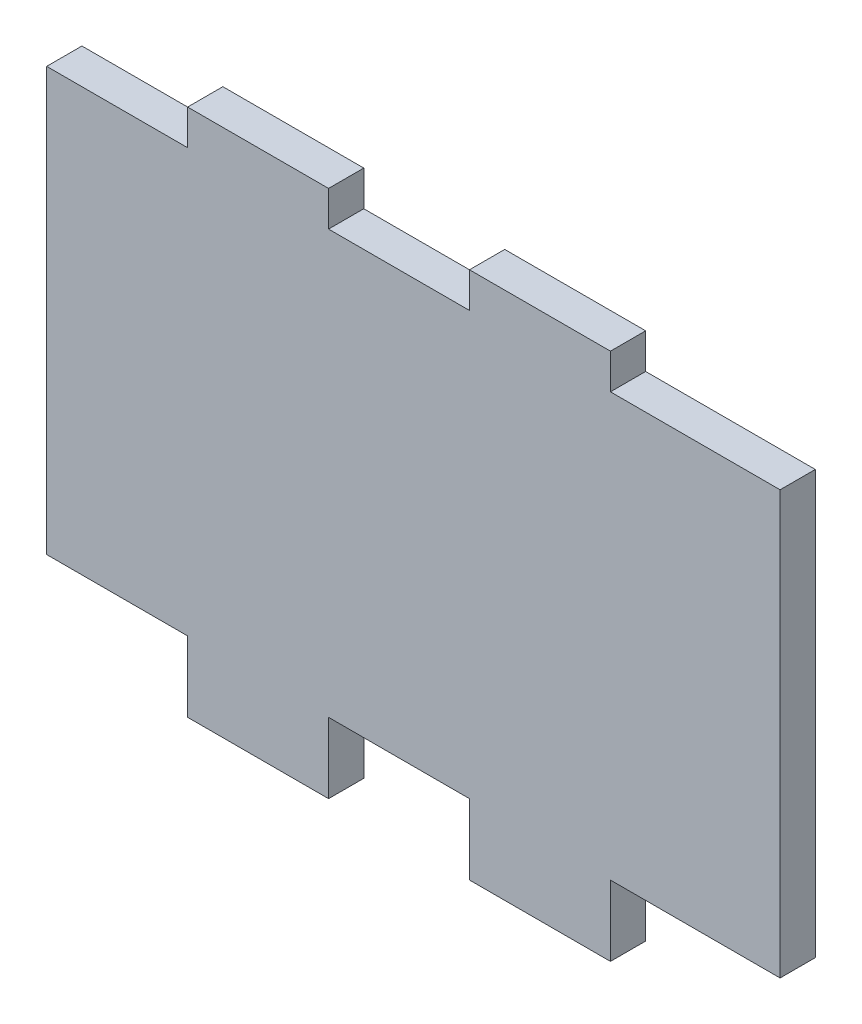
ISO-10303-21;
HEADER;
FILE_DESCRIPTION(('STEP AP214'),'2;1');
FILE_NAME('part.step','',(''),(''),'','','');
FILE_SCHEMA(('AUTOMOTIVE_DESIGN { 1 0 10303 214 1 1 1 1 }'));
ENDSEC;
DATA;
#1=APPLICATION_CONTEXT('core data for automotive mechanical design processes');
#2=APPLICATION_PROTOCOL_DEFINITION('international standard','automotive_design',2000,#1);
#3=PRODUCT_CONTEXT('',#1,'mechanical');
#4=PRODUCT('Part','Part','',(#3));
#5=PRODUCT_RELATED_PRODUCT_CATEGORY('part','',(#4));
#6=PRODUCT_DEFINITION_FORMATION('','',#4);
#7=PRODUCT_DEFINITION_CONTEXT('part definition',#1,'design');
#8=PRODUCT_DEFINITION('design','',#6,#7);
#9=PRODUCT_DEFINITION_SHAPE('','',#8);
#10=(LENGTH_UNIT() NAMED_UNIT(*) SI_UNIT(.MILLI.,.METRE.));
#11=(NAMED_UNIT(*) PLANE_ANGLE_UNIT() SI_UNIT($,.RADIAN.));
#12=(NAMED_UNIT(*) SI_UNIT($,.STERADIAN.) SOLID_ANGLE_UNIT());
#13=UNCERTAINTY_MEASURE_WITH_UNIT(LENGTH_MEASURE(1.E-05),#10,'distance_accuracy_value','');
#14=(GEOMETRIC_REPRESENTATION_CONTEXT(3) GLOBAL_UNCERTAINTY_ASSIGNED_CONTEXT((#13)) GLOBAL_UNIT_ASSIGNED_CONTEXT((#10,
#11,#12)) REPRESENTATION_CONTEXT('',''));
#15=CARTESIAN_POINT('',(0.,0.,0.));
#16=DIRECTION('',(0.,0.,1.));
#17=DIRECTION('',(1.,0.,0.));
#18=AXIS2_PLACEMENT_3D('',#15,#16,#17);
#19=CARTESIAN_POINT('',(-26.018829265,16.25,2.5));
#20=DIRECTION('',(1.,0.,0.));
#21=DIRECTION('',(0.,1.,0.));
#22=AXIS2_PLACEMENT_3D('',#19,#20,#21);
#23=PLANE('',#22);
#24=DIRECTION('',(0.,-1.,0.));
#25=VECTOR('',#24,1.);
#26=CARTESIAN_POINT('',(-26.018829265,16.25,0.));
#27=LINE('',#26,#25);
#28=CARTESIAN_POINT('',(-26.018829265,16.25,0.));
#29=VERTEX_POINT('',#28);
#30=CARTESIAN_POINT('',(-26.018829265,-13.75,0.));
#31=VERTEX_POINT('',#30);
#32=EDGE_CURVE('E201',#29,#31,#27,.T.);
#33=ORIENTED_EDGE('',*,*,#32,.T.);
#34=DIRECTION('',(0.,0.,-1.));
#35=VECTOR('',#34,1.);
#36=CARTESIAN_POINT('',(-26.018829265,-13.75,2.5));
#37=LINE('',#36,#35);
#38=CARTESIAN_POINT('',(-26.018829265,-13.75,2.5));
#39=VERTEX_POINT('',#38);
#40=EDGE_CURVE('E11',#39,#31,#37,.T.);
#41=ORIENTED_EDGE('',*,*,#40,.F.);
#42=DIRECTION('',(0.,-1.,0.));
#43=VECTOR('',#42,1.);
#44=CARTESIAN_POINT('',(-26.018829265,16.25,2.5));
#45=LINE('',#44,#43);
#46=CARTESIAN_POINT('',(-26.018829265,16.25,2.5));
#47=VERTEX_POINT('',#46);
#48=EDGE_CURVE('E239',#47,#39,#45,.T.);
#49=ORIENTED_EDGE('',*,*,#48,.F.);
#50=DIRECTION('',(0.,0.,-1.));
#51=VECTOR('',#50,1.);
#52=CARTESIAN_POINT('',(-26.018829265,16.25,2.5));
#53=LINE('',#52,#51);
#54=EDGE_CURVE('E197',#47,#29,#53,.T.);
#55=ORIENTED_EDGE('',*,*,#54,.T.);
#56=EDGE_LOOP('',(#33,#41,#49,#55));
#57=FACE_BOUND('',#56,.T.);
#58=ADVANCED_FACE('F33',(#57),#23,.F.);
#59=CARTESIAN_POINT('',(-26.018829265,-13.75,2.5));
#60=DIRECTION('',(0.,1.,0.));
#61=DIRECTION('',(0.,0.,1.));
#62=AXIS2_PLACEMENT_3D('',#59,#60,#61);
#63=PLANE('',#62);
#64=DIRECTION('',(1.,0.,0.));
#65=VECTOR('',#64,1.);
#66=CARTESIAN_POINT('',(-26.018829265,-13.75,0.));
#67=LINE('',#66,#65);
#68=CARTESIAN_POINT('',(-16.018829265,-13.75,0.));
#69=VERTEX_POINT('',#68);
#70=EDGE_CURVE('E204',#31,#69,#67,.T.);
#71=ORIENTED_EDGE('',*,*,#70,.T.);
#72=DIRECTION('',(0.,0.,-1.));
#73=VECTOR('',#72,1.);
#74=CARTESIAN_POINT('',(-16.018829265,-13.75,2.5));
#75=LINE('',#74,#73);
#76=CARTESIAN_POINT('',(-16.018829265,-13.75,2.5));
#77=VERTEX_POINT('',#76);
#78=EDGE_CURVE('E41',#77,#69,#75,.T.);
#79=ORIENTED_EDGE('',*,*,#78,.F.);
#80=DIRECTION('',(1.,0.,0.));
#81=VECTOR('',#80,1.);
#82=CARTESIAN_POINT('',(-26.018829265,-13.75,2.5));
#83=LINE('',#82,#81);
#84=EDGE_CURVE('E128',#39,#77,#83,.T.);
#85=ORIENTED_EDGE('',*,*,#84,.F.);
#86=ORIENTED_EDGE('',*,*,#40,.T.);
#87=EDGE_LOOP('',(#71,#79,#85,#86));
#88=FACE_BOUND('',#87,.T.);
#89=ADVANCED_FACE('F357',(#88),#63,.F.);
#90=CARTESIAN_POINT('',(-16.018829265,-13.75,2.5));
#91=DIRECTION('',(1.,0.,0.));
#92=DIRECTION('',(0.,1.,0.));
#93=AXIS2_PLACEMENT_3D('',#90,#91,#92);
#94=PLANE('',#93);
#95=DIRECTION('',(0.,-1.,0.));
#96=VECTOR('',#95,1.);
#97=CARTESIAN_POINT('',(-16.018829265,-13.75,0.));
#98=LINE('',#97,#96);
#99=CARTESIAN_POINT('',(-16.018829265,-18.75,0.));
#100=VERTEX_POINT('',#99);
#101=EDGE_CURVE('E206',#69,#100,#98,.T.);
#102=ORIENTED_EDGE('',*,*,#101,.T.);
#103=DIRECTION('',(0.,0.,-1.));
#104=VECTOR('',#103,1.);
#105=CARTESIAN_POINT('',(-16.018829265,-18.75,2.5));
#106=LINE('',#105,#104);
#107=CARTESIAN_POINT('',(-16.018829265,-18.75,2.5));
#108=VERTEX_POINT('',#107);
#109=EDGE_CURVE('E282',#108,#100,#106,.T.);
#110=ORIENTED_EDGE('',*,*,#109,.F.);
#111=DIRECTION('',(0.,-1.,0.));
#112=VECTOR('',#111,1.);
#113=CARTESIAN_POINT('',(-16.018829265,-13.75,2.5));
#114=LINE('',#113,#112);
#115=EDGE_CURVE('E290',#77,#108,#114,.T.);
#116=ORIENTED_EDGE('',*,*,#115,.F.);
#117=ORIENTED_EDGE('',*,*,#78,.T.);
#118=EDGE_LOOP('',(#102,#110,#116,#117));
#119=FACE_BOUND('',#118,.T.);
#120=ADVANCED_FACE('F288',(#119),#94,.F.);
#121=CARTESIAN_POINT('',(-16.018829265,-18.75,2.5));
#122=DIRECTION('',(0.,1.,0.));
#123=DIRECTION('',(0.,0.,1.));
#124=AXIS2_PLACEMENT_3D('',#121,#122,#123);
#125=PLANE('',#124);
#126=DIRECTION('',(1.,0.,0.));
#127=VECTOR('',#126,1.);
#128=CARTESIAN_POINT('',(-16.018829265,-18.75,0.));
#129=LINE('',#128,#127);
#130=CARTESIAN_POINT('',(-6.01882926500002,-18.75,0.));
#131=VERTEX_POINT('',#130);
#132=EDGE_CURVE('E208',#100,#131,#129,.T.);
#133=ORIENTED_EDGE('',*,*,#132,.T.);
#134=DIRECTION('',(0.,0.,-1.));
#135=VECTOR('',#134,1.);
#136=CARTESIAN_POINT('',(-6.01882926500002,-18.75,2.5));
#137=LINE('',#136,#135);
#138=CARTESIAN_POINT('',(-6.01882926500002,-18.75,2.5));
#139=VERTEX_POINT('',#138);
#140=EDGE_CURVE('E279',#139,#131,#137,.T.);
#141=ORIENTED_EDGE('',*,*,#140,.F.);
#142=DIRECTION('',(1.,0.,0.));
#143=VECTOR('',#142,1.);
#144=CARTESIAN_POINT('',(-16.018829265,-18.75,2.5));
#145=LINE('',#144,#143);
#146=EDGE_CURVE('E308',#108,#139,#145,.T.);
#147=ORIENTED_EDGE('',*,*,#146,.F.);
#148=ORIENTED_EDGE('',*,*,#109,.T.);
#149=EDGE_LOOP('',(#133,#141,#147,#148));
#150=FACE_BOUND('',#149,.T.);
#151=ADVANCED_FACE('F299',(#150),#125,.F.);
#152=CARTESIAN_POINT('',(-6.01882926500002,-18.75,2.5));
#153=DIRECTION('',(-1.,0.,0.));
#154=DIRECTION('',(0.,0.,1.));
#155=AXIS2_PLACEMENT_3D('',#152,#153,#154);
#156=PLANE('',#155);
#157=DIRECTION('',(0.,1.,0.));
#158=VECTOR('',#157,1.);
#159=CARTESIAN_POINT('',(-6.01882926500002,-18.75,0.));
#160=LINE('',#159,#158);
#161=CARTESIAN_POINT('',(-6.01882926500002,-13.75,0.));
#162=VERTEX_POINT('',#161);
#163=EDGE_CURVE('E210',#131,#162,#160,.T.);
#164=ORIENTED_EDGE('',*,*,#163,.T.);
#165=DIRECTION('',(0.,0.,-1.));
#166=VECTOR('',#165,1.);
#167=CARTESIAN_POINT('',(-6.01882926500002,-13.75,2.5));
#168=LINE('',#167,#166);
#169=CARTESIAN_POINT('',(-6.01882926500002,-13.75,2.5));
#170=VERTEX_POINT('',#169);
#171=EDGE_CURVE('E276',#170,#162,#168,.T.);
#172=ORIENTED_EDGE('',*,*,#171,.F.);
#173=DIRECTION('',(0.,1.,0.));
#174=VECTOR('',#173,1.);
#175=CARTESIAN_POINT('',(-6.01882926500002,-18.75,2.5));
#176=LINE('',#175,#174);
#177=EDGE_CURVE('E305',#139,#170,#176,.T.);
#178=ORIENTED_EDGE('',*,*,#177,.F.);
#179=ORIENTED_EDGE('',*,*,#140,.T.);
#180=EDGE_LOOP('',(#164,#172,#178,#179));
#181=FACE_BOUND('',#180,.T.);
#182=ADVANCED_FACE('F303',(#181),#156,.F.);
#183=CARTESIAN_POINT('',(-6.01882926500002,-13.75,2.5));
#184=DIRECTION('',(0.,1.,0.));
#185=DIRECTION('',(0.,0.,1.));
#186=AXIS2_PLACEMENT_3D('',#183,#184,#185);
#187=PLANE('',#186);
#188=DIRECTION('',(1.,0.,0.));
#189=VECTOR('',#188,1.);
#190=CARTESIAN_POINT('',(-6.01882926500002,-13.75,0.));
#191=LINE('',#190,#189);
#192=CARTESIAN_POINT('',(3.98117073499998,-13.75,0.));
#193=VERTEX_POINT('',#192);
#194=EDGE_CURVE('E212',#162,#193,#191,.T.);
#195=ORIENTED_EDGE('',*,*,#194,.T.);
#196=DIRECTION('',(0.,0.,-1.));
#197=VECTOR('',#196,1.);
#198=CARTESIAN_POINT('',(3.98117073499998,-13.75,2.5));
#199=LINE('',#198,#197);
#200=CARTESIAN_POINT('',(3.98117073499998,-13.75,2.5));
#201=VERTEX_POINT('',#200);
#202=EDGE_CURVE('E273',#201,#193,#199,.T.);
#203=ORIENTED_EDGE('',*,*,#202,.F.);
#204=DIRECTION('',(1.,0.,0.));
#205=VECTOR('',#204,1.);
#206=CARTESIAN_POINT('',(-6.01882926500002,-13.75,2.5));
#207=LINE('',#206,#205);
#208=EDGE_CURVE('E307',#170,#201,#207,.T.);
#209=ORIENTED_EDGE('',*,*,#208,.F.);
#210=ORIENTED_EDGE('',*,*,#171,.T.);
#211=EDGE_LOOP('',(#195,#203,#209,#210));
#212=FACE_BOUND('',#211,.T.);
#213=ADVANCED_FACE('F370',(#212),#187,.F.);
#214=CARTESIAN_POINT('',(3.98117073499998,-13.75,2.5));
#215=DIRECTION('',(1.,0.,0.));
#216=DIRECTION('',(0.,0.,-1.));
#217=AXIS2_PLACEMENT_3D('',#214,#215,#216);
#218=PLANE('',#217);
#219=DIRECTION('',(0.,-1.,0.));
#220=VECTOR('',#219,1.);
#221=CARTESIAN_POINT('',(3.98117073499998,-13.75,0.));
#222=LINE('',#221,#220);
#223=CARTESIAN_POINT('',(3.98117073499998,-18.75,0.));
#224=VERTEX_POINT('',#223);
#225=EDGE_CURVE('E214',#193,#224,#222,.T.);
#226=ORIENTED_EDGE('',*,*,#225,.T.);
#227=DIRECTION('',(0.,0.,-1.));
#228=VECTOR('',#227,1.);
#229=CARTESIAN_POINT('',(3.98117073499998,-18.75,2.5));
#230=LINE('',#229,#228);
#231=CARTESIAN_POINT('',(3.98117073499998,-18.75,2.5));
#232=VERTEX_POINT('',#231);
#233=EDGE_CURVE('E270',#232,#224,#230,.T.);
#234=ORIENTED_EDGE('',*,*,#233,.F.);
#235=DIRECTION('',(0.,-1.,0.));
#236=VECTOR('',#235,1.);
#237=CARTESIAN_POINT('',(3.98117073499998,-13.75,2.5));
#238=LINE('',#237,#236);
#239=EDGE_CURVE('E310',#201,#232,#238,.T.);
#240=ORIENTED_EDGE('',*,*,#239,.F.);
#241=ORIENTED_EDGE('',*,*,#202,.T.);
#242=EDGE_LOOP('',(#226,#234,#240,#241));
#243=FACE_BOUND('',#242,.T.);
#244=ADVANCED_FACE('F373',(#243),#218,.F.);
#245=CARTESIAN_POINT('',(3.98117073499998,-18.75,2.5));
#246=DIRECTION('',(0.,1.,0.));
#247=DIRECTION('',(0.,0.,1.));
#248=AXIS2_PLACEMENT_3D('',#245,#246,#247);
#249=PLANE('',#248);
#250=DIRECTION('',(1.,0.,0.));
#251=VECTOR('',#250,1.);
#252=CARTESIAN_POINT('',(3.98117073499998,-18.75,0.));
#253=LINE('',#252,#251);
#254=CARTESIAN_POINT('',(13.981170735,-18.75,0.));
#255=VERTEX_POINT('',#254);
#256=EDGE_CURVE('E216',#224,#255,#253,.T.);
#257=ORIENTED_EDGE('',*,*,#256,.T.);
#258=DIRECTION('',(0.,0.,-1.));
#259=VECTOR('',#258,1.);
#260=CARTESIAN_POINT('',(13.981170735,-18.75,2.5));
#261=LINE('',#260,#259);
#262=CARTESIAN_POINT('',(13.981170735,-18.75,2.5));
#263=VERTEX_POINT('',#262);
#264=EDGE_CURVE('E267',#263,#255,#261,.T.);
#265=ORIENTED_EDGE('',*,*,#264,.F.);
#266=DIRECTION('',(1.,0.,0.));
#267=VECTOR('',#266,1.);
#268=CARTESIAN_POINT('',(3.98117073499998,-18.75,2.5));
#269=LINE('',#268,#267);
#270=EDGE_CURVE('E316',#232,#263,#269,.T.);
#271=ORIENTED_EDGE('',*,*,#270,.F.);
#272=ORIENTED_EDGE('',*,*,#233,.T.);
#273=EDGE_LOOP('',(#257,#265,#271,#272));
#274=FACE_BOUND('',#273,.T.);
#275=ADVANCED_FACE('F377',(#274),#249,.F.);
#276=CARTESIAN_POINT('',(13.981170735,-18.75,2.5));
#277=DIRECTION('',(-1.,0.,0.));
#278=DIRECTION('',(0.,0.,1.));
#279=AXIS2_PLACEMENT_3D('',#276,#277,#278);
#280=PLANE('',#279);
#281=DIRECTION('',(0.,1.,0.));
#282=VECTOR('',#281,1.);
#283=CARTESIAN_POINT('',(13.981170735,-18.75,0.));
#284=LINE('',#283,#282);
#285=CARTESIAN_POINT('',(13.981170735,-13.75,0.));
#286=VERTEX_POINT('',#285);
#287=EDGE_CURVE('E218',#255,#286,#284,.T.);
#288=ORIENTED_EDGE('',*,*,#287,.T.);
#289=DIRECTION('',(0.,0.,-1.));
#290=VECTOR('',#289,1.);
#291=CARTESIAN_POINT('',(13.981170735,-13.75,2.5));
#292=LINE('',#291,#290);
#293=CARTESIAN_POINT('',(13.981170735,-13.75,2.5));
#294=VERTEX_POINT('',#293);
#295=EDGE_CURVE('E264',#294,#286,#292,.T.);
#296=ORIENTED_EDGE('',*,*,#295,.F.);
#297=DIRECTION('',(0.,1.,0.));
#298=VECTOR('',#297,1.);
#299=CARTESIAN_POINT('',(13.981170735,-18.75,2.5));
#300=LINE('',#299,#298);
#301=EDGE_CURVE('E318',#263,#294,#300,.T.);
#302=ORIENTED_EDGE('',*,*,#301,.F.);
#303=ORIENTED_EDGE('',*,*,#264,.T.);
#304=EDGE_LOOP('',(#288,#296,#302,#303));
#305=FACE_BOUND('',#304,.T.);
#306=ADVANCED_FACE('F381',(#305),#280,.F.);
#307=CARTESIAN_POINT('',(13.981170735,-13.75,2.5));
#308=DIRECTION('',(0.,1.,0.));
#309=DIRECTION('',(0.,0.,1.));
#310=AXIS2_PLACEMENT_3D('',#307,#308,#309);
#311=PLANE('',#310);
#312=DIRECTION('',(1.,0.,0.));
#313=VECTOR('',#312,1.);
#314=CARTESIAN_POINT('',(13.981170735,-13.75,0.));
#315=LINE('',#314,#313);
#316=CARTESIAN_POINT('',(26.018829265,-13.75,0.));
#317=VERTEX_POINT('',#316);
#318=EDGE_CURVE('E220',#286,#317,#315,.T.);
#319=ORIENTED_EDGE('',*,*,#318,.T.);
#320=DIRECTION('',(0.,0.,-1.));
#321=VECTOR('',#320,1.);
#322=CARTESIAN_POINT('',(26.018829265,-13.75,2.5));
#323=LINE('',#322,#321);
#324=CARTESIAN_POINT('',(26.018829265,-13.75,2.5));
#325=VERTEX_POINT('',#324);
#326=EDGE_CURVE('E261',#325,#317,#323,.T.);
#327=ORIENTED_EDGE('',*,*,#326,.F.);
#328=DIRECTION('',(1.,0.,0.));
#329=VECTOR('',#328,1.);
#330=CARTESIAN_POINT('',(13.981170735,-13.75,2.5));
#331=LINE('',#330,#329);
#332=EDGE_CURVE('E320',#294,#325,#331,.T.);
#333=ORIENTED_EDGE('',*,*,#332,.F.);
#334=ORIENTED_EDGE('',*,*,#295,.T.);
#335=EDGE_LOOP('',(#319,#327,#333,#334));
#336=FACE_BOUND('',#335,.T.);
#337=ADVANCED_FACE('F385',(#336),#311,.F.);
#338=CARTESIAN_POINT('',(26.018829265,16.25,2.5));
#339=DIRECTION('',(-1.,0.,0.));
#340=DIRECTION('',(0.,-1.,0.));
#341=AXIS2_PLACEMENT_3D('',#338,#339,#340);
#342=PLANE('',#341);
#343=DIRECTION('',(0.,1.,0.));
#344=VECTOR('',#343,1.);
#345=CARTESIAN_POINT('',(26.018829265,16.25,0.));
#346=LINE('',#345,#344);
#347=CARTESIAN_POINT('',(26.018829265,16.25,0.));
#348=VERTEX_POINT('',#347);
#349=EDGE_CURVE('E222',#317,#348,#346,.T.);
#350=ORIENTED_EDGE('',*,*,#349,.T.);
#351=DIRECTION('',(0.,0.,-1.));
#352=VECTOR('',#351,1.);
#353=CARTESIAN_POINT('',(26.018829265,16.25,2.5));
#354=LINE('',#353,#352);
#355=CARTESIAN_POINT('',(26.018829265,16.25,2.5));
#356=VERTEX_POINT('',#355);
#357=EDGE_CURVE('E258',#356,#348,#354,.T.);
#358=ORIENTED_EDGE('',*,*,#357,.F.);
#359=DIRECTION('',(0.,1.,0.));
#360=VECTOR('',#359,1.);
#361=CARTESIAN_POINT('',(26.018829265,16.25,2.5));
#362=LINE('',#361,#360);
#363=EDGE_CURVE('E322',#325,#356,#362,.T.);
#364=ORIENTED_EDGE('',*,*,#363,.F.);
#365=ORIENTED_EDGE('',*,*,#326,.T.);
#366=EDGE_LOOP('',(#350,#358,#364,#365));
#367=FACE_BOUND('',#366,.T.);
#368=ADVANCED_FACE('F389',(#367),#342,.F.);
#369=CARTESIAN_POINT('',(13.981170735,16.25,2.5));
#370=DIRECTION('',(0.,-1.,0.));
#371=DIRECTION('',(0.,0.,-1.));
#372=AXIS2_PLACEMENT_3D('',#369,#370,#371);
#373=PLANE('',#372);
#374=DIRECTION('',(-1.,0.,0.));
#375=VECTOR('',#374,1.);
#376=CARTESIAN_POINT('',(13.981170735,16.25,0.));
#377=LINE('',#376,#375);
#378=CARTESIAN_POINT('',(13.981170735,16.25,0.));
#379=VERTEX_POINT('',#378);
#380=EDGE_CURVE('E224',#348,#379,#377,.T.);
#381=ORIENTED_EDGE('',*,*,#380,.T.);
#382=DIRECTION('',(0.,0.,-1.));
#383=VECTOR('',#382,1.);
#384=CARTESIAN_POINT('',(13.981170735,16.25,2.5));
#385=LINE('',#384,#383);
#386=CARTESIAN_POINT('',(13.981170735,16.25,2.5));
#387=VERTEX_POINT('',#386);
#388=EDGE_CURVE('E255',#387,#379,#385,.T.);
#389=ORIENTED_EDGE('',*,*,#388,.F.);
#390=DIRECTION('',(-1.,0.,0.));
#391=VECTOR('',#390,1.);
#392=CARTESIAN_POINT('',(13.981170735,16.25,2.5));
#393=LINE('',#392,#391);
#394=EDGE_CURVE('E324',#356,#387,#393,.T.);
#395=ORIENTED_EDGE('',*,*,#394,.F.);
#396=ORIENTED_EDGE('',*,*,#357,.T.);
#397=EDGE_LOOP('',(#381,#389,#395,#396));
#398=FACE_BOUND('',#397,.T.);
#399=ADVANCED_FACE('F393',(#398),#373,.F.);
#400=CARTESIAN_POINT('',(13.981170735,18.75,2.5));
#401=DIRECTION('',(-1.,0.,0.));
#402=DIRECTION('',(0.,0.,1.));
#403=AXIS2_PLACEMENT_3D('',#400,#401,#402);
#404=PLANE('',#403);
#405=DIRECTION('',(0.,1.,0.));
#406=VECTOR('',#405,1.);
#407=CARTESIAN_POINT('',(13.981170735,18.75,0.));
#408=LINE('',#407,#406);
#409=CARTESIAN_POINT('',(13.981170735,18.75,0.));
#410=VERTEX_POINT('',#409);
#411=EDGE_CURVE('E226',#379,#410,#408,.T.);
#412=ORIENTED_EDGE('',*,*,#411,.T.);
#413=DIRECTION('',(0.,0.,-1.));
#414=VECTOR('',#413,1.);
#415=CARTESIAN_POINT('',(13.981170735,18.75,2.5));
#416=LINE('',#415,#414);
#417=CARTESIAN_POINT('',(13.981170735,18.75,2.5));
#418=VERTEX_POINT('',#417);
#419=EDGE_CURVE('E252',#418,#410,#416,.T.);
#420=ORIENTED_EDGE('',*,*,#419,.F.);
#421=DIRECTION('',(0.,1.,0.));
#422=VECTOR('',#421,1.);
#423=CARTESIAN_POINT('',(13.981170735,18.75,2.5));
#424=LINE('',#423,#422);
#425=EDGE_CURVE('E326',#387,#418,#424,.T.);
#426=ORIENTED_EDGE('',*,*,#425,.F.);
#427=ORIENTED_EDGE('',*,*,#388,.T.);
#428=EDGE_LOOP('',(#412,#420,#426,#427));
#429=FACE_BOUND('',#428,.T.);
#430=ADVANCED_FACE('F397',(#429),#404,.F.);
#431=CARTESIAN_POINT('',(3.98117073499998,18.75,2.5));
#432=DIRECTION('',(0.,-1.,0.));
#433=DIRECTION('',(0.,0.,-1.));
#434=AXIS2_PLACEMENT_3D('',#431,#432,#433);
#435=PLANE('',#434);
#436=DIRECTION('',(-1.,0.,0.));
#437=VECTOR('',#436,1.);
#438=CARTESIAN_POINT('',(3.98117073499998,18.75,0.));
#439=LINE('',#438,#437);
#440=CARTESIAN_POINT('',(3.98117073499998,18.75,0.));
#441=VERTEX_POINT('',#440);
#442=EDGE_CURVE('E228',#410,#441,#439,.T.);
#443=ORIENTED_EDGE('',*,*,#442,.T.);
#444=DIRECTION('',(0.,0.,-1.));
#445=VECTOR('',#444,1.);
#446=CARTESIAN_POINT('',(3.98117073499998,18.75,2.5));
#447=LINE('',#446,#445);
#448=CARTESIAN_POINT('',(3.98117073499998,18.75,2.5));
#449=VERTEX_POINT('',#448);
#450=EDGE_CURVE('E249',#449,#441,#447,.T.);
#451=ORIENTED_EDGE('',*,*,#450,.F.);
#452=DIRECTION('',(-1.,0.,0.));
#453=VECTOR('',#452,1.);
#454=CARTESIAN_POINT('',(3.98117073499998,18.75,2.5));
#455=LINE('',#454,#453);
#456=EDGE_CURVE('E328',#418,#449,#455,.T.);
#457=ORIENTED_EDGE('',*,*,#456,.F.);
#458=ORIENTED_EDGE('',*,*,#419,.T.);
#459=EDGE_LOOP('',(#443,#451,#457,#458));
#460=FACE_BOUND('',#459,.T.);
#461=ADVANCED_FACE('F401',(#460),#435,.F.);
#462=CARTESIAN_POINT('',(3.98117073499998,16.25,2.5));
#463=DIRECTION('',(1.,0.,0.));
#464=DIRECTION('',(0.,0.,-1.));
#465=AXIS2_PLACEMENT_3D('',#462,#463,#464);
#466=PLANE('',#465);
#467=DIRECTION('',(0.,-1.,0.));
#468=VECTOR('',#467,1.);
#469=CARTESIAN_POINT('',(3.98117073499998,16.25,0.));
#470=LINE('',#469,#468);
#471=CARTESIAN_POINT('',(3.98117073499998,16.25,0.));
#472=VERTEX_POINT('',#471);
#473=EDGE_CURVE('E230',#441,#472,#470,.T.);
#474=ORIENTED_EDGE('',*,*,#473,.T.);
#475=DIRECTION('',(0.,0.,-1.));
#476=VECTOR('',#475,1.);
#477=CARTESIAN_POINT('',(3.98117073499998,16.25,2.5));
#478=LINE('',#477,#476);
#479=CARTESIAN_POINT('',(3.98117073499998,16.25,2.5));
#480=VERTEX_POINT('',#479);
#481=EDGE_CURVE('E246',#480,#472,#478,.T.);
#482=ORIENTED_EDGE('',*,*,#481,.F.);
#483=DIRECTION('',(0.,-1.,0.));
#484=VECTOR('',#483,1.);
#485=CARTESIAN_POINT('',(3.98117073499998,16.25,2.5));
#486=LINE('',#485,#484);
#487=EDGE_CURVE('E330',#449,#480,#486,.T.);
#488=ORIENTED_EDGE('',*,*,#487,.F.);
#489=ORIENTED_EDGE('',*,*,#450,.T.);
#490=EDGE_LOOP('',(#474,#482,#488,#489));
#491=FACE_BOUND('',#490,.T.);
#492=ADVANCED_FACE('F405',(#491),#466,.F.);
#493=CARTESIAN_POINT('',(-6.01882926500002,16.25,2.5));
#494=DIRECTION('',(0.,-1.,0.));
#495=DIRECTION('',(0.,0.,-1.));
#496=AXIS2_PLACEMENT_3D('',#493,#494,#495);
#497=PLANE('',#496);
#498=DIRECTION('',(-1.,0.,0.));
#499=VECTOR('',#498,1.);
#500=CARTESIAN_POINT('',(-6.01882926500002,16.25,0.));
#501=LINE('',#500,#499);
#502=CARTESIAN_POINT('',(-6.01882926500002,16.25,0.));
#503=VERTEX_POINT('',#502);
#504=EDGE_CURVE('E232',#472,#503,#501,.T.);
#505=ORIENTED_EDGE('',*,*,#504,.T.);
#506=DIRECTION('',(0.,0.,-1.));
#507=VECTOR('',#506,1.);
#508=CARTESIAN_POINT('',(-6.01882926500002,16.25,2.5));
#509=LINE('',#508,#507);
#510=CARTESIAN_POINT('',(-6.01882926500002,16.25,2.5));
#511=VERTEX_POINT('',#510);
#512=EDGE_CURVE('E243',#511,#503,#509,.T.);
#513=ORIENTED_EDGE('',*,*,#512,.F.);
#514=DIRECTION('',(-1.,0.,0.));
#515=VECTOR('',#514,1.);
#516=CARTESIAN_POINT('',(-6.01882926500002,16.25,2.5));
#517=LINE('',#516,#515);
#518=EDGE_CURVE('E332',#480,#511,#517,.T.);
#519=ORIENTED_EDGE('',*,*,#518,.F.);
#520=ORIENTED_EDGE('',*,*,#481,.T.);
#521=EDGE_LOOP('',(#505,#513,#519,#520));
#522=FACE_BOUND('',#521,.T.);
#523=ADVANCED_FACE('F338',(#522),#497,.F.);
#524=CARTESIAN_POINT('',(-6.01882926500002,18.75,2.5));
#525=DIRECTION('',(-1.,0.,0.));
#526=DIRECTION('',(0.,0.,1.));
#527=AXIS2_PLACEMENT_3D('',#524,#525,#526);
#528=PLANE('',#527);
#529=DIRECTION('',(0.,1.,0.));
#530=VECTOR('',#529,1.);
#531=CARTESIAN_POINT('',(-6.01882926500002,18.75,0.));
#532=LINE('',#531,#530);
#533=CARTESIAN_POINT('',(-6.01882926500002,18.75,0.));
#534=VERTEX_POINT('',#533);
#535=EDGE_CURVE('E234',#503,#534,#532,.T.);
#536=ORIENTED_EDGE('',*,*,#535,.T.);
#537=DIRECTION('',(0.,0.,-1.));
#538=VECTOR('',#537,1.);
#539=CARTESIAN_POINT('',(-6.01882926500002,18.75,2.5));
#540=LINE('',#539,#538);
#541=CARTESIAN_POINT('',(-6.01882926500002,18.75,2.5));
#542=VERTEX_POINT('',#541);
#543=EDGE_CURVE('E192',#542,#534,#540,.T.);
#544=ORIENTED_EDGE('',*,*,#543,.F.);
#545=DIRECTION('',(0.,1.,0.));
#546=VECTOR('',#545,1.);
#547=CARTESIAN_POINT('',(-6.01882926500002,18.75,2.5));
#548=LINE('',#547,#546);
#549=EDGE_CURVE('E183',#511,#542,#548,.T.);
#550=ORIENTED_EDGE('',*,*,#549,.F.);
#551=ORIENTED_EDGE('',*,*,#512,.T.);
#552=EDGE_LOOP('',(#536,#544,#550,#551));
#553=FACE_BOUND('',#552,.T.);
#554=ADVANCED_FACE('F342',(#553),#528,.F.);
#555=CARTESIAN_POINT('',(-16.018829265,18.75,2.5));
#556=DIRECTION('',(0.,-1.,0.));
#557=DIRECTION('',(0.,0.,-1.));
#558=AXIS2_PLACEMENT_3D('',#555,#556,#557);
#559=PLANE('',#558);
#560=DIRECTION('',(-1.,0.,0.));
#561=VECTOR('',#560,1.);
#562=CARTESIAN_POINT('',(-16.018829265,18.75,0.));
#563=LINE('',#562,#561);
#564=CARTESIAN_POINT('',(-16.018829265,18.75,0.));
#565=VERTEX_POINT('',#564);
#566=EDGE_CURVE('E191',#534,#565,#563,.T.);
#567=ORIENTED_EDGE('',*,*,#566,.T.);
#568=DIRECTION('',(0.,0.,-1.));
#569=VECTOR('',#568,1.);
#570=CARTESIAN_POINT('',(-16.018829265,18.75,2.5));
#571=LINE('',#570,#569);
#572=CARTESIAN_POINT('',(-16.018829265,18.75,2.5));
#573=VERTEX_POINT('',#572);
#574=EDGE_CURVE('E188',#573,#565,#571,.T.);
#575=ORIENTED_EDGE('',*,*,#574,.F.);
#576=DIRECTION('',(-1.,0.,0.));
#577=VECTOR('',#576,1.);
#578=CARTESIAN_POINT('',(-16.018829265,18.75,2.5));
#579=LINE('',#578,#577);
#580=EDGE_CURVE('E177',#542,#573,#579,.T.);
#581=ORIENTED_EDGE('',*,*,#580,.F.);
#582=ORIENTED_EDGE('',*,*,#543,.T.);
#583=EDGE_LOOP('',(#567,#575,#581,#582));
#584=FACE_BOUND('',#583,.T.);
#585=ADVANCED_FACE('F189',(#584),#559,.F.);
#586=CARTESIAN_POINT('',(-16.018829265,16.25,2.5));
#587=DIRECTION('',(1.,0.,0.));
#588=DIRECTION('',(0.,0.,-1.));
#589=AXIS2_PLACEMENT_3D('',#586,#587,#588);
#590=PLANE('',#589);
#591=DIRECTION('',(0.,-1.,0.));
#592=VECTOR('',#591,1.);
#593=CARTESIAN_POINT('',(-16.018829265,16.25,0.));
#594=LINE('',#593,#592);
#595=CARTESIAN_POINT('',(-16.018829265,16.25,0.));
#596=VERTEX_POINT('',#595);
#597=EDGE_CURVE('E114',#565,#596,#594,.T.);
#598=ORIENTED_EDGE('',*,*,#597,.T.);
#599=DIRECTION('',(0.,0.,-1.));
#600=VECTOR('',#599,1.);
#601=CARTESIAN_POINT('',(-16.018829265,16.25,2.5));
#602=LINE('',#601,#600);
#603=CARTESIAN_POINT('',(-16.018829265,16.25,2.5));
#604=VERTEX_POINT('',#603);
#605=EDGE_CURVE('E193',#604,#596,#602,.T.);
#606=ORIENTED_EDGE('',*,*,#605,.F.);
#607=DIRECTION('',(0.,-1.,0.));
#608=VECTOR('',#607,1.);
#609=CARTESIAN_POINT('',(-16.018829265,16.25,2.5));
#610=LINE('',#609,#608);
#611=EDGE_CURVE('E181',#573,#604,#610,.T.);
#612=ORIENTED_EDGE('',*,*,#611,.F.);
#613=ORIENTED_EDGE('',*,*,#574,.T.);
#614=EDGE_LOOP('',(#598,#606,#612,#613));
#615=FACE_BOUND('',#614,.T.);
#616=ADVANCED_FACE('F195',(#615),#590,.F.);
#617=CARTESIAN_POINT('',(-26.018829265,16.25,2.5));
#618=DIRECTION('',(0.,-1.,0.));
#619=DIRECTION('',(0.,0.,-1.));
#620=AXIS2_PLACEMENT_3D('',#617,#618,#619);
#621=PLANE('',#620);
#622=DIRECTION('',(-1.,0.,0.));
#623=VECTOR('',#622,1.);
#624=CARTESIAN_POINT('',(-26.018829265,16.25,0.));
#625=LINE('',#624,#623);
#626=EDGE_CURVE('E120',#596,#29,#625,.T.);
#627=ORIENTED_EDGE('',*,*,#626,.T.);
#628=ORIENTED_EDGE('',*,*,#54,.F.);
#629=DIRECTION('',(-1.,0.,0.));
#630=VECTOR('',#629,1.);
#631=CARTESIAN_POINT('',(-26.018829265,16.25,2.5));
#632=LINE('',#631,#630);
#633=EDGE_CURVE('E49',#604,#47,#632,.T.);
#634=ORIENTED_EDGE('',*,*,#633,.F.);
#635=ORIENTED_EDGE('',*,*,#605,.T.);
#636=EDGE_LOOP('',(#627,#628,#634,#635));
#637=FACE_BOUND('',#636,.T.);
#638=ADVANCED_FACE('F346',(#637),#621,.F.);
#639=CARTESIAN_POINT('',(0.,0.,2.5));
#640=DIRECTION('',(0.,0.,1.));
#641=DIRECTION('',(1.,0.,0.));
#642=AXIS2_PLACEMENT_3D('',#639,#640,#641);
#643=PLANE('',#642);
#644=ORIENTED_EDGE('',*,*,#48,.T.);
#645=ORIENTED_EDGE('',*,*,#84,.T.);
#646=ORIENTED_EDGE('',*,*,#115,.T.);
#647=ORIENTED_EDGE('',*,*,#146,.T.);
#648=ORIENTED_EDGE('',*,*,#177,.T.);
#649=ORIENTED_EDGE('',*,*,#208,.T.);
#650=ORIENTED_EDGE('',*,*,#239,.T.);
#651=ORIENTED_EDGE('',*,*,#270,.T.);
#652=ORIENTED_EDGE('',*,*,#301,.T.);
#653=ORIENTED_EDGE('',*,*,#332,.T.);
#654=ORIENTED_EDGE('',*,*,#363,.T.);
#655=ORIENTED_EDGE('',*,*,#394,.T.);
#656=ORIENTED_EDGE('',*,*,#425,.T.);
#657=ORIENTED_EDGE('',*,*,#456,.T.);
#658=ORIENTED_EDGE('',*,*,#487,.T.);
#659=ORIENTED_EDGE('',*,*,#518,.T.);
#660=ORIENTED_EDGE('',*,*,#549,.T.);
#661=ORIENTED_EDGE('',*,*,#580,.T.);
#662=ORIENTED_EDGE('',*,*,#611,.T.);
#663=ORIENTED_EDGE('',*,*,#633,.T.);
#664=EDGE_LOOP('',(#644,#645,#646,#647,#648,#649,#650,#651,#652,#653,#654,#655,#656,#657,#658,
#659,#660,#661,#662,#663));
#665=FACE_BOUND('',#664,.T.);
#666=ADVANCED_FACE('F179',(#665),#643,.T.);
#667=CARTESIAN_POINT('',(0.,0.,0.));
#668=DIRECTION('',(0.,0.,1.));
#669=DIRECTION('',(1.,0.,0.));
#670=AXIS2_PLACEMENT_3D('',#667,#668,#669);
#671=PLANE('',#670);
#672=ORIENTED_EDGE('',*,*,#32,.F.);
#673=ORIENTED_EDGE('',*,*,#626,.F.);
#674=ORIENTED_EDGE('',*,*,#597,.F.);
#675=ORIENTED_EDGE('',*,*,#566,.F.);
#676=ORIENTED_EDGE('',*,*,#535,.F.);
#677=ORIENTED_EDGE('',*,*,#504,.F.);
#678=ORIENTED_EDGE('',*,*,#473,.F.);
#679=ORIENTED_EDGE('',*,*,#442,.F.);
#680=ORIENTED_EDGE('',*,*,#411,.F.);
#681=ORIENTED_EDGE('',*,*,#380,.F.);
#682=ORIENTED_EDGE('',*,*,#349,.F.);
#683=ORIENTED_EDGE('',*,*,#318,.F.);
#684=ORIENTED_EDGE('',*,*,#287,.F.);
#685=ORIENTED_EDGE('',*,*,#256,.F.);
#686=ORIENTED_EDGE('',*,*,#225,.F.);
#687=ORIENTED_EDGE('',*,*,#194,.F.);
#688=ORIENTED_EDGE('',*,*,#163,.F.);
#689=ORIENTED_EDGE('',*,*,#132,.F.);
#690=ORIENTED_EDGE('',*,*,#101,.F.);
#691=ORIENTED_EDGE('',*,*,#70,.F.);
#692=EDGE_LOOP('',(#672,#673,#674,#675,#676,#677,#678,#679,#680,#681,#682,#683,#684,#685,#686,
#687,#688,#689,#690,#691));
#693=FACE_BOUND('',#692,.T.);
#694=ADVANCED_FACE('F294',(#693),#671,.F.);
#695=CLOSED_SHELL('',(#58,#89,#120,#151,#182,#213,#244,#275,#306,#337,#368,#399,#430,#461,#492,
#523,#554,#585,#616,#638,#666,#694));
#696=MANIFOLD_SOLID_BREP('B2',#695);
#697=ADVANCED_BREP_SHAPE_REPRESENTATION('',(#18,#696),#14);
#698=SHAPE_DEFINITION_REPRESENTATION(#9,#697);
ENDSEC;
END-ISO-10303-21;
